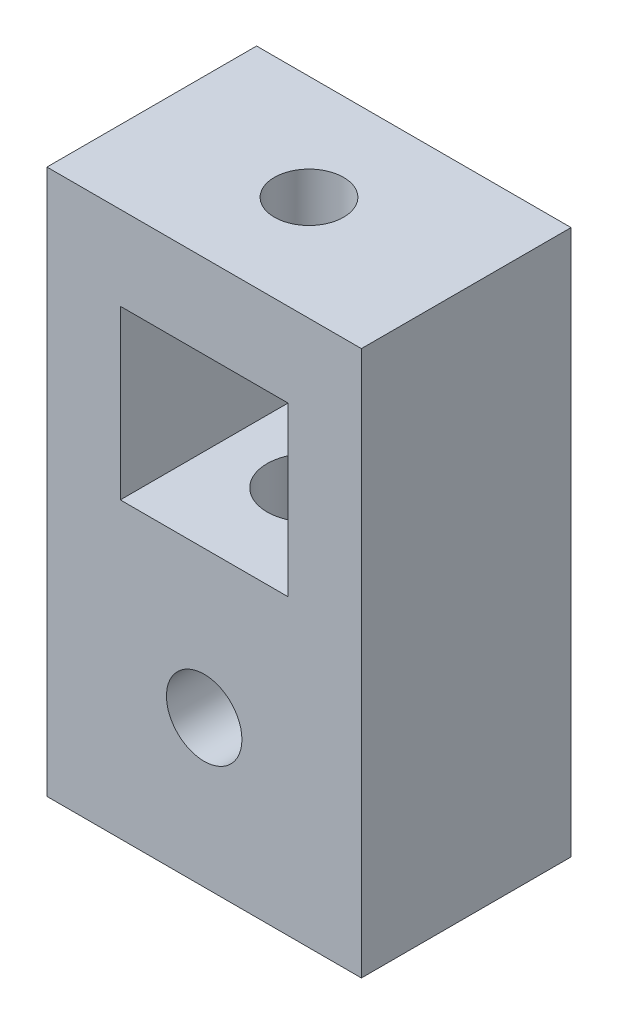
ISO-10303-21;
HEADER;
FILE_DESCRIPTION(('STEP AP214'),'2;1');
FILE_NAME('part.step','',(''),(''),'','','');
FILE_SCHEMA(('AUTOMOTIVE_DESIGN { 1 0 10303 214 1 1 1 1 }'));
ENDSEC;
DATA;
#1=APPLICATION_CONTEXT('core data for automotive mechanical design processes');
#2=APPLICATION_PROTOCOL_DEFINITION('international standard','automotive_design',2000,#1);
#3=PRODUCT_CONTEXT('',#1,'mechanical');
#4=PRODUCT('Part','Part','',(#3));
#5=PRODUCT_RELATED_PRODUCT_CATEGORY('part','',(#4));
#6=PRODUCT_DEFINITION_FORMATION('','',#4);
#7=PRODUCT_DEFINITION_CONTEXT('part definition',#1,'design');
#8=PRODUCT_DEFINITION('design','',#6,#7);
#9=PRODUCT_DEFINITION_SHAPE('','',#8);
#10=(LENGTH_UNIT() NAMED_UNIT(*) SI_UNIT(.MILLI.,.METRE.));
#11=(NAMED_UNIT(*) PLANE_ANGLE_UNIT() SI_UNIT($,.RADIAN.));
#12=(NAMED_UNIT(*) SI_UNIT($,.STERADIAN.) SOLID_ANGLE_UNIT());
#13=UNCERTAINTY_MEASURE_WITH_UNIT(LENGTH_MEASURE(1.E-05),#10,'distance_accuracy_value','');
#14=(GEOMETRIC_REPRESENTATION_CONTEXT(3) GLOBAL_UNCERTAINTY_ASSIGNED_CONTEXT((#13)) GLOBAL_UNIT_ASSIGNED_CONTEXT((#10,
#11,#12)) REPRESENTATION_CONTEXT('',''));
#15=CARTESIAN_POINT('',(0.,0.,0.));
#16=DIRECTION('',(0.,0.,1.));
#17=DIRECTION('',(1.,0.,0.));
#18=AXIS2_PLACEMENT_3D('',#15,#16,#17);
#19=CARTESIAN_POINT('',(-8.09528560097024,9.94655528991138,10.));
#20=DIRECTION('',(0.,-1.,0.));
#21=DIRECTION('',(0.,0.,-1.));
#22=AXIS2_PLACEMENT_3D('',#19,#20,#21);
#23=PLANE('',#22);
#24=CARTESIAN_POINT('',(-0.59528560097024,9.94655528991138,5.));
#25=DIRECTION('',(0.,1.,0.));
#26=DIRECTION('',(0.,0.,1.));
#27=AXIS2_PLACEMENT_3D('',#24,#25,#26);
#28=CIRCLE('',#27,2.);
#29=CARTESIAN_POINT('',(-0.59528560097024,9.94655528991138,7.));
#30=VERTEX_POINT('',#29);
#31=EDGE_CURVE('E166',#30,#30,#28,.T.);
#32=ORIENTED_EDGE('',*,*,#31,.F.);
#33=EDGE_LOOP('',(#32));
#34=FACE_BOUND('',#33,.T.);
#35=DIRECTION('',(0.,0.,1.));
#36=VECTOR('',#35,1.);
#37=CARTESIAN_POINT('',(3.40471439902976,9.94655528991138,10.));
#38=LINE('',#37,#36);
#39=CARTESIAN_POINT('',(3.40471439902976,9.94655528991138,0.));
#40=VERTEX_POINT('',#39);
#41=CARTESIAN_POINT('',(3.40471439902976,9.94655528991138,10.));
#42=VERTEX_POINT('',#41);
#43=EDGE_CURVE('E133',#40,#42,#38,.T.);
#44=ORIENTED_EDGE('',*,*,#43,.F.);
#45=DIRECTION('',(-1.,0.,0.));
#46=VECTOR('',#45,1.);
#47=CARTESIAN_POINT('',(-8.09528560097024,9.94655528991138,0.));
#48=LINE('',#47,#46);
#49=CARTESIAN_POINT('',(-4.59528560097024,9.94655528991138,0.));
#50=VERTEX_POINT('',#49);
#51=EDGE_CURVE('E106',#40,#50,#48,.T.);
#52=ORIENTED_EDGE('',*,*,#51,.T.);
#53=DIRECTION('',(0.,0.,-1.));
#54=VECTOR('',#53,1.);
#55=CARTESIAN_POINT('',(-4.59528560097024,9.94655528991138,10.));
#56=LINE('',#55,#54);
#57=CARTESIAN_POINT('',(-4.59528560097024,9.94655528991138,10.));
#58=VERTEX_POINT('',#57);
#59=EDGE_CURVE('E146',#58,#50,#56,.T.);
#60=ORIENTED_EDGE('',*,*,#59,.F.);
#61=DIRECTION('',(-1.,0.,0.));
#62=VECTOR('',#61,1.);
#63=CARTESIAN_POINT('',(-8.09528560097024,9.94655528991138,10.));
#64=LINE('',#63,#62);
#65=EDGE_CURVE('E37',#42,#58,#64,.T.);
#66=ORIENTED_EDGE('',*,*,#65,.F.);
#67=EDGE_LOOP('',(#44,#52,#60,#66));
#68=FACE_BOUND('',#67,.T.);
#69=ADVANCED_FACE('F33',(#34,#68),#23,.F.);
#70=CARTESIAN_POINT('',(-8.09528560097024,9.94655528991138,10.));
#71=DIRECTION('',(1.,0.,0.));
#72=DIRECTION('',(0.,1.,0.));
#73=AXIS2_PLACEMENT_3D('',#70,#71,#72);
#74=PLANE('',#73);
#75=DIRECTION('',(0.,-1.,0.));
#76=VECTOR('',#75,1.);
#77=CARTESIAN_POINT('',(-8.09528560097024,9.94655528991138,0.));
#78=LINE('',#77,#76);
#79=CARTESIAN_POINT('',(-8.09528560097024,21.9465552899114,0.));
#80=VERTEX_POINT('',#79);
#81=CARTESIAN_POINT('',(-8.09528560097024,-4.05344471008862,0.));
#82=VERTEX_POINT('',#81);
#83=EDGE_CURVE('E181',#80,#82,#78,.T.);
#84=ORIENTED_EDGE('',*,*,#83,.T.);
#85=DIRECTION('',(0.,0.,-1.));
#86=VECTOR('',#85,1.);
#87=CARTESIAN_POINT('',(-8.09528560097024,-4.05344471008862,10.));
#88=LINE('',#87,#86);
#89=CARTESIAN_POINT('',(-8.09528560097024,-4.05344471008862,10.));
#90=VERTEX_POINT('',#89);
#91=EDGE_CURVE('E11',#90,#82,#88,.T.);
#92=ORIENTED_EDGE('',*,*,#91,.F.);
#93=DIRECTION('',(0.,-1.,0.));
#94=VECTOR('',#93,1.);
#95=CARTESIAN_POINT('',(-8.09528560097024,9.94655528991138,10.));
#96=LINE('',#95,#94);
#97=CARTESIAN_POINT('',(-8.09528560097024,21.9465552899114,10.));
#98=VERTEX_POINT('',#97);
#99=EDGE_CURVE('E99',#98,#90,#96,.T.);
#100=ORIENTED_EDGE('',*,*,#99,.F.);
#101=DIRECTION('',(0.,0.,1.));
#102=VECTOR('',#101,1.);
#103=CARTESIAN_POINT('',(-8.09528560097024,21.9465552899114,10.));
#104=LINE('',#103,#102);
#105=EDGE_CURVE('E103',#80,#98,#104,.T.);
#106=ORIENTED_EDGE('',*,*,#105,.F.);
#107=EDGE_LOOP('',(#84,#92,#100,#106));
#108=FACE_BOUND('',#107,.T.);
#109=ADVANCED_FACE('F35',(#108),#74,.F.);
#110=CARTESIAN_POINT('',(-8.09528560097024,-4.05344471008862,10.));
#111=DIRECTION('',(0.,1.,0.));
#112=DIRECTION('',(0.,0.,1.));
#113=AXIS2_PLACEMENT_3D('',#110,#111,#112);
#114=PLANE('',#113);
#115=DIRECTION('',(1.,0.,0.));
#116=VECTOR('',#115,1.);
#117=CARTESIAN_POINT('',(-8.09528560097024,-4.05344471008862,0.));
#118=LINE('',#117,#116);
#119=CARTESIAN_POINT('',(6.90471439902976,-4.05344471008862,0.));
#120=VERTEX_POINT('',#119);
#121=EDGE_CURVE('E182',#82,#120,#118,.T.);
#122=ORIENTED_EDGE('',*,*,#121,.T.);
#123=DIRECTION('',(0.,0.,-1.));
#124=VECTOR('',#123,1.);
#125=CARTESIAN_POINT('',(6.90471439902976,-4.05344471008862,10.));
#126=LINE('',#125,#124);
#127=CARTESIAN_POINT('',(6.90471439902976,-4.05344471008862,10.));
#128=VERTEX_POINT('',#127);
#129=EDGE_CURVE('E43',#128,#120,#126,.T.);
#130=ORIENTED_EDGE('',*,*,#129,.F.);
#131=DIRECTION('',(1.,0.,0.));
#132=VECTOR('',#131,1.);
#133=CARTESIAN_POINT('',(-8.09528560097024,-4.05344471008862,10.));
#134=LINE('',#133,#132);
#135=EDGE_CURVE('E105',#90,#128,#134,.T.);
#136=ORIENTED_EDGE('',*,*,#135,.F.);
#137=ORIENTED_EDGE('',*,*,#91,.T.);
#138=EDGE_LOOP('',(#122,#130,#136,#137));
#139=FACE_BOUND('',#138,.T.);
#140=ADVANCED_FACE('F189',(#139),#114,.F.);
#141=CARTESIAN_POINT('',(6.90471439902976,9.94655528991138,10.));
#142=DIRECTION('',(-1.,0.,0.));
#143=DIRECTION('',(0.,-1.,0.));
#144=AXIS2_PLACEMENT_3D('',#141,#142,#143);
#145=PLANE('',#144);
#146=DIRECTION('',(0.,1.,0.));
#147=VECTOR('',#146,1.);
#148=CARTESIAN_POINT('',(6.90471439902976,9.94655528991138,0.));
#149=LINE('',#148,#147);
#150=CARTESIAN_POINT('',(6.90471439902976,21.9465552899114,0.));
#151=VERTEX_POINT('',#150);
#152=EDGE_CURVE('E169',#120,#151,#149,.T.);
#153=ORIENTED_EDGE('',*,*,#152,.T.);
#154=DIRECTION('',(0.,0.,-1.));
#155=VECTOR('',#154,1.);
#156=CARTESIAN_POINT('',(6.90471439902976,21.9465552899114,10.));
#157=LINE('',#156,#155);
#158=CARTESIAN_POINT('',(6.90471439902976,21.9465552899114,10.));
#159=VERTEX_POINT('',#158);
#160=EDGE_CURVE('E116',#159,#151,#157,.T.);
#161=ORIENTED_EDGE('',*,*,#160,.F.);
#162=DIRECTION('',(0.,1.,0.));
#163=VECTOR('',#162,1.);
#164=CARTESIAN_POINT('',(6.90471439902976,9.94655528991138,10.));
#165=LINE('',#164,#163);
#166=EDGE_CURVE('E112',#128,#159,#165,.T.);
#167=ORIENTED_EDGE('',*,*,#166,.F.);
#168=ORIENTED_EDGE('',*,*,#129,.T.);
#169=EDGE_LOOP('',(#153,#161,#167,#168));
#170=FACE_BOUND('',#169,.T.);
#171=ADVANCED_FACE('F185',(#170),#145,.F.);
#172=CARTESIAN_POINT('',(0.,0.,10.));
#173=DIRECTION('',(0.,0.,1.));
#174=DIRECTION('',(1.,0.,0.));
#175=AXIS2_PLACEMENT_3D('',#172,#173,#174);
#176=PLANE('',#175);
#177=DIRECTION('',(0.,-1.,0.));
#178=VECTOR('',#177,1.);
#179=CARTESIAN_POINT('',(-4.59528560097024,17.9465552899114,10.));
#180=LINE('',#179,#178);
#181=CARTESIAN_POINT('',(-4.59528560097024,17.9465552899114,10.));
#182=VERTEX_POINT('',#181);
#183=EDGE_CURVE('E161',#182,#58,#180,.T.);
#184=ORIENTED_EDGE('',*,*,#183,.F.);
#185=DIRECTION('',(1.,0.,0.));
#186=VECTOR('',#185,1.);
#187=CARTESIAN_POINT('',(-8.09528560097024,17.9465552899114,10.));
#188=LINE('',#187,#186);
#189=CARTESIAN_POINT('',(3.40471439902976,17.9465552899114,10.));
#190=VERTEX_POINT('',#189);
#191=EDGE_CURVE('E125',#182,#190,#188,.T.);
#192=ORIENTED_EDGE('',*,*,#191,.T.);
#193=DIRECTION('',(0.,-1.,0.));
#194=VECTOR('',#193,1.);
#195=CARTESIAN_POINT('',(3.40471439902976,17.9465552899114,10.));
#196=LINE('',#195,#194);
#197=EDGE_CURVE('E144',#190,#42,#196,.T.);
#198=ORIENTED_EDGE('',*,*,#197,.T.);
#199=ORIENTED_EDGE('',*,*,#65,.T.);
#200=EDGE_LOOP('',(#184,#192,#198,#199));
#201=FACE_BOUND('',#200,.T.);
#202=CARTESIAN_POINT('',(-0.59528560097024,2.94655528991138,10.));
#203=DIRECTION('',(0.,0.,1.));
#204=DIRECTION('',(1.,0.,0.));
#205=AXIS2_PLACEMENT_3D('',#202,#203,#204);
#206=CIRCLE('',#205,1.8);
#207=CARTESIAN_POINT('',(1.20471439902976,2.94655528991138,10.));
#208=VERTEX_POINT('',#207);
#209=EDGE_CURVE('E254',#208,#208,#206,.T.);
#210=ORIENTED_EDGE('',*,*,#209,.F.);
#211=EDGE_LOOP('',(#210));
#212=FACE_BOUND('',#211,.T.);
#213=ORIENTED_EDGE('',*,*,#99,.T.);
#214=ORIENTED_EDGE('',*,*,#135,.T.);
#215=ORIENTED_EDGE('',*,*,#166,.T.);
#216=DIRECTION('',(1.,0.,0.));
#217=VECTOR('',#216,1.);
#218=CARTESIAN_POINT('',(-8.09528560097024,21.9465552899114,10.));
#219=LINE('',#218,#217);
#220=EDGE_CURVE('E109',#98,#159,#219,.T.);
#221=ORIENTED_EDGE('',*,*,#220,.F.);
#222=EDGE_LOOP('',(#213,#214,#215,#221));
#223=FACE_BOUND('',#222,.T.);
#224=ADVANCED_FACE('F110',(#201,#212,#223),#176,.T.);
#225=CARTESIAN_POINT('',(0.,0.,0.));
#226=DIRECTION('',(0.,0.,1.));
#227=DIRECTION('',(1.,0.,0.));
#228=AXIS2_PLACEMENT_3D('',#225,#226,#227);
#229=PLANE('',#228);
#230=ORIENTED_EDGE('',*,*,#83,.F.);
#231=DIRECTION('',(-1.,0.,0.));
#232=VECTOR('',#231,1.);
#233=CARTESIAN_POINT('',(-8.09528560097024,21.9465552899114,0.));
#234=LINE('',#233,#232);
#235=EDGE_CURVE('E121',#151,#80,#234,.T.);
#236=ORIENTED_EDGE('',*,*,#235,.F.);
#237=ORIENTED_EDGE('',*,*,#152,.F.);
#238=ORIENTED_EDGE('',*,*,#121,.F.);
#239=EDGE_LOOP('',(#230,#236,#237,#238));
#240=FACE_BOUND('',#239,.T.);
#241=CARTESIAN_POINT('',(-0.59528560097024,2.94655528991138,0.));
#242=DIRECTION('',(0.,0.,1.));
#243=DIRECTION('',(1.,0.,0.));
#244=AXIS2_PLACEMENT_3D('',#241,#242,#243);
#245=CIRCLE('',#244,1.8);
#246=CARTESIAN_POINT('',(1.20471439902976,2.94655528991138,0.));
#247=VERTEX_POINT('',#246);
#248=EDGE_CURVE('E183',#247,#247,#245,.T.);
#249=ORIENTED_EDGE('',*,*,#248,.T.);
#250=EDGE_LOOP('',(#249));
#251=FACE_BOUND('',#250,.T.);
#252=DIRECTION('',(-1.,0.,0.));
#253=VECTOR('',#252,1.);
#254=CARTESIAN_POINT('',(-8.09528560097024,17.9465552899114,0.));
#255=LINE('',#254,#253);
#256=CARTESIAN_POINT('',(3.40471439902976,17.9465552899114,0.));
#257=VERTEX_POINT('',#256);
#258=CARTESIAN_POINT('',(-4.59528560097024,17.9465552899114,0.));
#259=VERTEX_POINT('',#258);
#260=EDGE_CURVE('E122',#257,#259,#255,.T.);
#261=ORIENTED_EDGE('',*,*,#260,.T.);
#262=DIRECTION('',(0.,-1.,0.));
#263=VECTOR('',#262,1.);
#264=CARTESIAN_POINT('',(-4.59528560097024,17.9465552899114,0.));
#265=LINE('',#264,#263);
#266=EDGE_CURVE('E150',#259,#50,#265,.T.);
#267=ORIENTED_EDGE('',*,*,#266,.T.);
#268=ORIENTED_EDGE('',*,*,#51,.F.);
#269=DIRECTION('',(0.,-1.,0.));
#270=VECTOR('',#269,1.);
#271=CARTESIAN_POINT('',(3.40471439902976,17.9465552899114,0.));
#272=LINE('',#271,#270);
#273=EDGE_CURVE('E139',#257,#40,#272,.T.);
#274=ORIENTED_EDGE('',*,*,#273,.F.);
#275=EDGE_LOOP('',(#261,#267,#268,#274));
#276=FACE_BOUND('',#275,.T.);
#277=ADVANCED_FACE('F187',(#240,#251,#276),#229,.F.);
#278=CARTESIAN_POINT('',(-0.59528560097024,2.94655528991138,0.));
#279=DIRECTION('',(0.,0.,1.));
#280=DIRECTION('',(1.,0.,0.));
#281=AXIS2_PLACEMENT_3D('',#278,#279,#280);
#282=CYLINDRICAL_SURFACE('',#281,1.8);
#283=ORIENTED_EDGE('',*,*,#248,.F.);
#284=EDGE_LOOP('',(#283));
#285=FACE_BOUND('',#284,.T.);
#286=ORIENTED_EDGE('',*,*,#209,.T.);
#287=EDGE_LOOP('',(#286));
#288=FACE_BOUND('',#287,.T.);
#289=ADVANCED_FACE('F205',(#285,#288),#282,.F.);
#290=CARTESIAN_POINT('',(-0.59528560097024,4.94655528991138,5.));
#291=DIRECTION('',(0.,1.,0.));
#292=DIRECTION('',(0.,0.,1.));
#293=AXIS2_PLACEMENT_3D('',#290,#291,#292);
#294=CYLINDRICAL_SURFACE('',#293,2.);
#295=CARTESIAN_POINT('',(-0.59528560097024,4.94655528991138,5.));
#296=DIRECTION('',(0.,1.,0.));
#297=DIRECTION('',(0.,0.,1.));
#298=AXIS2_PLACEMENT_3D('',#295,#296,#297);
#299=CIRCLE('',#298,2.);
#300=CARTESIAN_POINT('',(-0.59528560097024,4.94655528991138,7.));
#301=VERTEX_POINT('',#300);
#302=EDGE_CURVE('E153',#301,#301,#299,.T.);
#303=ORIENTED_EDGE('',*,*,#302,.F.);
#304=EDGE_LOOP('',(#303));
#305=FACE_BOUND('',#304,.T.);
#306=ORIENTED_EDGE('',*,*,#31,.T.);
#307=EDGE_LOOP('',(#306));
#308=FACE_BOUND('',#307,.T.);
#309=ADVANCED_FACE('F210',(#305,#308),#294,.F.);
#310=CARTESIAN_POINT('',(-0.59528560097024,4.94655528991138,5.));
#311=DIRECTION('',(0.,1.,0.));
#312=DIRECTION('',(0.,0.,1.));
#313=AXIS2_PLACEMENT_3D('',#310,#311,#312);
#314=PLANE('',#313);
#315=ORIENTED_EDGE('',*,*,#302,.T.);
#316=EDGE_LOOP('',(#315));
#317=FACE_BOUND('',#316,.T.);
#318=ADVANCED_FACE('F214',(#317),#314,.T.);
#319=CARTESIAN_POINT('',(-4.59528560097024,17.9465552899114,10.));
#320=DIRECTION('',(-1.,0.,0.));
#321=DIRECTION('',(0.,0.,1.));
#322=AXIS2_PLACEMENT_3D('',#319,#320,#321);
#323=PLANE('',#322);
#324=ORIENTED_EDGE('',*,*,#59,.T.);
#325=ORIENTED_EDGE('',*,*,#266,.F.);
#326=DIRECTION('',(0.,0.,-1.));
#327=VECTOR('',#326,1.);
#328=CARTESIAN_POINT('',(-4.59528560097024,17.9465552899114,10.));
#329=LINE('',#328,#327);
#330=EDGE_CURVE('E147',#182,#259,#329,.T.);
#331=ORIENTED_EDGE('',*,*,#330,.F.);
#332=ORIENTED_EDGE('',*,*,#183,.T.);
#333=EDGE_LOOP('',(#324,#325,#331,#332));
#334=FACE_BOUND('',#333,.T.);
#335=ADVANCED_FACE('F218',(#334),#323,.F.);
#336=CARTESIAN_POINT('',(3.40471439902976,17.9465552899114,10.));
#337=DIRECTION('',(1.,0.,0.));
#338=DIRECTION('',(0.,0.,-1.));
#339=AXIS2_PLACEMENT_3D('',#336,#337,#338);
#340=PLANE('',#339);
#341=ORIENTED_EDGE('',*,*,#43,.T.);
#342=ORIENTED_EDGE('',*,*,#197,.F.);
#343=DIRECTION('',(0.,0.,1.));
#344=VECTOR('',#343,1.);
#345=CARTESIAN_POINT('',(3.40471439902976,17.9465552899114,10.));
#346=LINE('',#345,#344);
#347=EDGE_CURVE('E136',#257,#190,#346,.T.);
#348=ORIENTED_EDGE('',*,*,#347,.F.);
#349=ORIENTED_EDGE('',*,*,#273,.T.);
#350=EDGE_LOOP('',(#341,#342,#348,#349));
#351=FACE_BOUND('',#350,.T.);
#352=ADVANCED_FACE('F222',(#351),#340,.F.);
#353=CARTESIAN_POINT('',(0.,17.9465552899114,0.));
#354=DIRECTION('',(0.,-1.,0.));
#355=DIRECTION('',(0.,0.,-1.));
#356=AXIS2_PLACEMENT_3D('',#353,#354,#355);
#357=PLANE('',#356);
#358=CARTESIAN_POINT('',(-0.59528560097024,17.9465552899114,5.));
#359=DIRECTION('',(0.,-1.,0.));
#360=DIRECTION('',(0.,0.,-1.));
#361=AXIS2_PLACEMENT_3D('',#358,#359,#360);
#362=CIRCLE('',#361,1.65);
#363=CARTESIAN_POINT('',(-0.59528560097024,17.9465552899114,3.35));
#364=VERTEX_POINT('',#363);
#365=EDGE_CURVE('E128',#364,#364,#362,.F.);
#366=ORIENTED_EDGE('',*,*,#365,.T.);
#367=EDGE_LOOP('',(#366));
#368=FACE_BOUND('',#367,.T.);
#369=ORIENTED_EDGE('',*,*,#330,.T.);
#370=ORIENTED_EDGE('',*,*,#260,.F.);
#371=ORIENTED_EDGE('',*,*,#347,.T.);
#372=ORIENTED_EDGE('',*,*,#191,.F.);
#373=EDGE_LOOP('',(#369,#370,#371,#372));
#374=FACE_BOUND('',#373,.T.);
#375=ADVANCED_FACE('F226',(#368,#374),#357,.T.);
#376=CARTESIAN_POINT('',(0.,21.9465552899114,0.));
#377=DIRECTION('',(0.,-1.,0.));
#378=DIRECTION('',(0.,0.,-1.));
#379=AXIS2_PLACEMENT_3D('',#376,#377,#378);
#380=PLANE('',#379);
#381=CARTESIAN_POINT('',(-0.59528560097024,21.9465552899114,5.));
#382=DIRECTION('',(0.,1.,0.));
#383=DIRECTION('',(0.,0.,1.));
#384=AXIS2_PLACEMENT_3D('',#381,#382,#383);
#385=CIRCLE('',#384,1.65);
#386=CARTESIAN_POINT('',(-0.59528560097024,21.9465552899114,6.65));
#387=VERTEX_POINT('',#386);
#388=EDGE_CURVE('E242',#387,#387,#385,.T.);
#389=ORIENTED_EDGE('',*,*,#388,.F.);
#390=EDGE_LOOP('',(#389));
#391=FACE_BOUND('',#390,.T.);
#392=ORIENTED_EDGE('',*,*,#105,.T.);
#393=ORIENTED_EDGE('',*,*,#220,.T.);
#394=ORIENTED_EDGE('',*,*,#160,.T.);
#395=ORIENTED_EDGE('',*,*,#235,.T.);
#396=EDGE_LOOP('',(#392,#393,#394,#395));
#397=FACE_BOUND('',#396,.T.);
#398=ADVANCED_FACE('F119',(#391,#397),#380,.F.);
#399=CARTESIAN_POINT('',(-0.59528560097024,13.2796505340802,5.));
#400=DIRECTION('',(0.,1.,0.));
#401=DIRECTION('',(0.,0.,1.));
#402=AXIS2_PLACEMENT_3D('',#399,#400,#401);
#403=CYLINDRICAL_SURFACE('',#402,1.65);
#404=ORIENTED_EDGE('',*,*,#388,.T.);
#405=EDGE_LOOP('',(#404));
#406=FACE_BOUND('',#405,.T.);
#407=ORIENTED_EDGE('',*,*,#365,.F.);
#408=EDGE_LOOP('',(#407));
#409=FACE_BOUND('',#408,.T.);
#410=ADVANCED_FACE('F233',(#406,#409),#403,.F.);
#411=CLOSED_SHELL('',(#69,#109,#140,#171,#224,#277,#289,#309,#318,#335,#352,#375,#398,#410));
#412=MANIFOLD_SOLID_BREP('B2',#411);
#413=ADVANCED_BREP_SHAPE_REPRESENTATION('',(#18,#412),#14);
#414=SHAPE_DEFINITION_REPRESENTATION(#9,#413);
ENDSEC;
END-ISO-10303-21;
